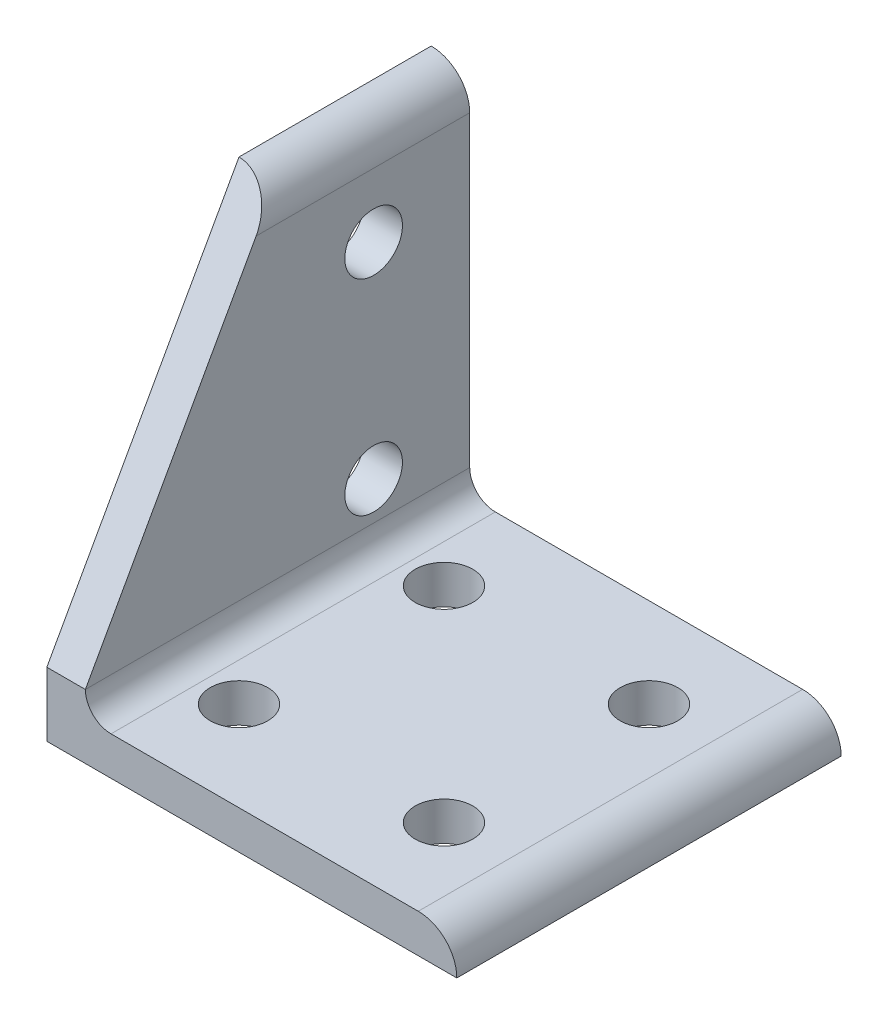
ISO-10303-21;
HEADER;
FILE_DESCRIPTION(('STEP AP214'),'2;1');
FILE_NAME('part.step','',(''),(''),'','','');
FILE_SCHEMA(('AUTOMOTIVE_DESIGN { 1 0 10303 214 1 1 1 1 }'));
ENDSEC;
DATA;
#1=APPLICATION_CONTEXT('core data for automotive mechanical design processes');
#2=APPLICATION_PROTOCOL_DEFINITION('international standard','automotive_design',2000,#1);
#3=PRODUCT_CONTEXT('',#1,'mechanical');
#4=PRODUCT('Part','Part','',(#3));
#5=PRODUCT_RELATED_PRODUCT_CATEGORY('part','',(#4));
#6=PRODUCT_DEFINITION_FORMATION('','',#4);
#7=PRODUCT_DEFINITION_CONTEXT('part definition',#1,'design');
#8=PRODUCT_DEFINITION('design','',#6,#7);
#9=PRODUCT_DEFINITION_SHAPE('','',#8);
#10=(LENGTH_UNIT() NAMED_UNIT(*) SI_UNIT(.MILLI.,.METRE.));
#11=(NAMED_UNIT(*) PLANE_ANGLE_UNIT() SI_UNIT($,.RADIAN.));
#12=(NAMED_UNIT(*) SI_UNIT($,.STERADIAN.) SOLID_ANGLE_UNIT());
#13=UNCERTAINTY_MEASURE_WITH_UNIT(LENGTH_MEASURE(1.E-05),#10,'distance_accuracy_value','');
#14=(GEOMETRIC_REPRESENTATION_CONTEXT(3) GLOBAL_UNCERTAINTY_ASSIGNED_CONTEXT((#13)) GLOBAL_UNIT_ASSIGNED_CONTEXT((#10,
#11,#12)) REPRESENTATION_CONTEXT('',''));
#15=CARTESIAN_POINT('',(0.,0.,0.));
#16=DIRECTION('',(0.,0.,1.));
#17=DIRECTION('',(1.,0.,0.));
#18=AXIS2_PLACEMENT_3D('',#15,#16,#17);
#19=CARTESIAN_POINT('',(-25.4,20.6248,-23.8125));
#20=DIRECTION('',(0.,0.,1.));
#21=DIRECTION('',(1.,0.,0.));
#22=AXIS2_PLACEMENT_3D('',#19,#20,#21);
#23=CYLINDRICAL_SURFACE('',#22,4.7752);
#24=CARTESIAN_POINT('',(-25.4,20.6248,2.65367516301126));
#25=DIRECTION('',(0.,-0.485752909125678,-0.874096168208019));
#26=DIRECTION('',(0.,-0.874096168208019,0.485752909125678));
#27=AXIS2_PLACEMENT_3D('',#24,#25,#26);
#28=ELLIPSE('',#27,5.46301445273421,4.7752);
#29=CARTESIAN_POINT('',(-20.6248,20.6248,2.65367516301126));
#30=VERTEX_POINT('',#29);
#31=CARTESIAN_POINT('',(-25.4,25.4,0.));
#32=VERTEX_POINT('',#31);
#33=EDGE_CURVE('E102',#30,#32,#28,.F.);
#34=ORIENTED_EDGE('',*,*,#33,.F.);
#35=DIRECTION('',(0.,0.,1.));
#36=VECTOR('',#35,1.);
#37=CARTESIAN_POINT('',(-20.6248,20.6248,-23.8125));
#38=LINE('',#37,#36);
#39=CARTESIAN_POINT('',(-20.6248,20.6248,-23.8125));
#40=VERTEX_POINT('',#39);
#41=EDGE_CURVE('E11',#40,#30,#38,.T.);
#42=ORIENTED_EDGE('',*,*,#41,.F.);
#43=CARTESIAN_POINT('',(-25.4,20.6248,-23.8125));
#44=DIRECTION('',(0.,0.,1.));
#45=DIRECTION('',(1.,0.,0.));
#46=AXIS2_PLACEMENT_3D('',#43,#44,#45);
#47=CIRCLE('',#46,4.7752);
#48=CARTESIAN_POINT('',(-25.4,25.4,-23.8125));
#49=VERTEX_POINT('',#48);
#50=EDGE_CURVE('E120',#40,#49,#47,.T.);
#51=ORIENTED_EDGE('',*,*,#50,.T.);
#52=DIRECTION('',(0.,0.,1.));
#53=VECTOR('',#52,1.);
#54=CARTESIAN_POINT('',(-25.4,25.4,-23.8125));
#55=LINE('',#54,#53);
#56=EDGE_CURVE('E44',#49,#32,#55,.T.);
#57=ORIENTED_EDGE('',*,*,#56,.T.);
#58=EDGE_LOOP('',(#34,#42,#51,#57));
#59=FACE_BOUND('',#58,.T.);
#60=ADVANCED_FACE('F41',(#59),#23,.T.);
#61=CARTESIAN_POINT('',(-20.6248,20.6248,-23.8125));
#62=DIRECTION('',(1.,0.,0.));
#63=DIRECTION('',(0.,1.,0.));
#64=AXIS2_PLACEMENT_3D('',#61,#62,#63);
#65=PLANE('',#64);
#66=CARTESIAN_POINT('',(-20.6248,12.7,-11.90625));
#67=DIRECTION('',(1.,0.,0.));
#68=DIRECTION('',(0.,1.,0.));
#69=AXIS2_PLACEMENT_3D('',#66,#67,#68);
#70=CIRCLE('',#69,3.5687);
#71=CARTESIAN_POINT('',(-20.6248,16.2687,-11.90625));
#72=VERTEX_POINT('',#71);
#73=EDGE_CURVE('E225',#72,#72,#70,.T.);
#74=ORIENTED_EDGE('',*,*,#73,.F.);
#75=EDGE_LOOP('',(#74));
#76=FACE_BOUND('',#75,.T.);
#77=CARTESIAN_POINT('',(-20.6248,-12.7,-11.90625));
#78=DIRECTION('',(1.,0.,0.));
#79=DIRECTION('',(0.,-1.,0.));
#80=AXIS2_PLACEMENT_3D('',#77,#78,#79);
#81=CIRCLE('',#80,3.5687);
#82=CARTESIAN_POINT('',(-20.6248,-16.2687,-11.90625));
#83=VERTEX_POINT('',#82);
#84=EDGE_CURVE('E216',#83,#83,#81,.T.);
#85=ORIENTED_EDGE('',*,*,#84,.F.);
#86=EDGE_LOOP('',(#85));
#87=FACE_BOUND('',#86,.T.);
#88=DIRECTION('',(0.,0.874096168208019,-0.485752909125678));
#89=VECTOR('',#88,1.);
#90=CARTESIAN_POINT('',(-20.6248,31.8621992004833,-3.59117471870367));
#91=LINE('',#90,#89);
#92=CARTESIAN_POINT('',(-20.6248,-17.4498,23.8125));
#93=VERTEX_POINT('',#92);
#94=EDGE_CURVE('E105',#93,#30,#91,.T.);
#95=ORIENTED_EDGE('',*,*,#94,.F.);
#96=DIRECTION('',(0.,0.,1.));
#97=VECTOR('',#96,1.);
#98=CARTESIAN_POINT('',(-20.6248,-17.4498,-23.8125));
#99=LINE('',#98,#97);
#100=CARTESIAN_POINT('',(-20.6248,-17.4498,-23.8125));
#101=VERTEX_POINT('',#100);
#102=EDGE_CURVE('E50',#101,#93,#99,.T.);
#103=ORIENTED_EDGE('',*,*,#102,.F.);
#104=DIRECTION('',(0.,1.,0.));
#105=VECTOR('',#104,1.);
#106=CARTESIAN_POINT('',(-20.6248,20.6248,-23.8125));
#107=LINE('',#106,#105);
#108=EDGE_CURVE('E123',#101,#40,#107,.T.);
#109=ORIENTED_EDGE('',*,*,#108,.T.);
#110=ORIENTED_EDGE('',*,*,#41,.T.);
#111=EDGE_LOOP('',(#95,#103,#109,#110));
#112=FACE_BOUND('',#111,.T.);
#113=ADVANCED_FACE('F295',(#76,#87,#112),#65,.T.);
#114=CARTESIAN_POINT('',(-17.4498,-17.4498,-23.8125));
#115=DIRECTION('',(0.,0.,1.));
#116=DIRECTION('',(1.,0.,0.));
#117=AXIS2_PLACEMENT_3D('',#114,#115,#116);
#118=CYLINDRICAL_SURFACE('',#117,3.175);
#119=ORIENTED_EDGE('',*,*,#102,.T.);
#120=CARTESIAN_POINT('',(-17.4498,-17.4498,23.8125));
#121=DIRECTION('',(0.,0.,-1.));
#122=DIRECTION('',(1.,0.,0.));
#123=AXIS2_PLACEMENT_3D('',#120,#121,#122);
#124=CIRCLE('',#123,3.175);
#125=CARTESIAN_POINT('',(-17.4498,-20.6248,23.8125));
#126=VERTEX_POINT('',#125);
#127=EDGE_CURVE('E177',#126,#93,#124,.T.);
#128=ORIENTED_EDGE('',*,*,#127,.F.);
#129=DIRECTION('',(0.,0.,1.));
#130=VECTOR('',#129,1.);
#131=CARTESIAN_POINT('',(-17.4498,-20.6248,-23.8125));
#132=LINE('',#131,#130);
#133=CARTESIAN_POINT('',(-17.4498,-20.6248,-23.8125));
#134=VERTEX_POINT('',#133);
#135=EDGE_CURVE('E143',#134,#126,#132,.T.);
#136=ORIENTED_EDGE('',*,*,#135,.F.);
#137=CARTESIAN_POINT('',(-17.4498,-17.4498,-23.8125));
#138=DIRECTION('',(0.,0.,-1.));
#139=DIRECTION('',(1.,0.,0.));
#140=AXIS2_PLACEMENT_3D('',#137,#138,#139);
#141=CIRCLE('',#140,3.175);
#142=EDGE_CURVE('E129',#134,#101,#141,.T.);
#143=ORIENTED_EDGE('',*,*,#142,.T.);
#144=EDGE_LOOP('',(#119,#128,#136,#143));
#145=FACE_BOUND('',#144,.T.);
#146=ADVANCED_FACE('F203',(#145),#118,.F.);
#147=CARTESIAN_POINT('',(-17.4498,-20.6248,-23.8125));
#148=DIRECTION('',(0.,1.,0.));
#149=DIRECTION('',(-1.,0.,0.));
#150=AXIS2_PLACEMENT_3D('',#147,#148,#149);
#151=PLANE('',#150);
#152=CARTESIAN_POINT('',(-12.7,-20.6248,12.7));
#153=DIRECTION('',(0.,1.,0.));
#154=DIRECTION('',(1.,0.,0.));
#155=AXIS2_PLACEMENT_3D('',#152,#153,#154);
#156=CIRCLE('',#155,3.5687);
#157=CARTESIAN_POINT('',(-9.1313,-20.6248,12.7));
#158=VERTEX_POINT('',#157);
#159=EDGE_CURVE('E240',#158,#158,#156,.T.);
#160=ORIENTED_EDGE('',*,*,#159,.F.);
#161=EDGE_LOOP('',(#160));
#162=FACE_BOUND('',#161,.T.);
#163=CARTESIAN_POINT('',(12.7,-20.6248,12.7));
#164=DIRECTION('',(0.,1.,0.));
#165=DIRECTION('',(1.,0.,0.));
#166=AXIS2_PLACEMENT_3D('',#163,#164,#165);
#167=CIRCLE('',#166,3.5687);
#168=CARTESIAN_POINT('',(16.2687,-20.6248,12.7));
#169=VERTEX_POINT('',#168);
#170=EDGE_CURVE('E248',#169,#169,#167,.T.);
#171=ORIENTED_EDGE('',*,*,#170,.F.);
#172=EDGE_LOOP('',(#171));
#173=FACE_BOUND('',#172,.T.);
#174=CARTESIAN_POINT('',(12.7,-20.6248,-12.7));
#175=DIRECTION('',(0.,1.,0.));
#176=DIRECTION('',(-1.,0.,0.));
#177=AXIS2_PLACEMENT_3D('',#174,#175,#176);
#178=CIRCLE('',#177,3.5687);
#179=CARTESIAN_POINT('',(9.1313,-20.6248,-12.7));
#180=VERTEX_POINT('',#179);
#181=EDGE_CURVE('E256',#180,#180,#178,.T.);
#182=ORIENTED_EDGE('',*,*,#181,.F.);
#183=EDGE_LOOP('',(#182));
#184=FACE_BOUND('',#183,.T.);
#185=CARTESIAN_POINT('',(-12.7,-20.6248,-12.7));
#186=DIRECTION('',(0.,1.,0.));
#187=DIRECTION('',(-1.,0.,0.));
#188=AXIS2_PLACEMENT_3D('',#185,#186,#187);
#189=CIRCLE('',#188,3.5687);
#190=CARTESIAN_POINT('',(-16.2687,-20.6248,-12.7));
#191=VERTEX_POINT('',#190);
#192=EDGE_CURVE('E232',#191,#191,#189,.T.);
#193=ORIENTED_EDGE('',*,*,#192,.F.);
#194=EDGE_LOOP('',(#193));
#195=FACE_BOUND('',#194,.T.);
#196=ORIENTED_EDGE('',*,*,#135,.T.);
#197=DIRECTION('',(-1.,0.,0.));
#198=VECTOR('',#197,1.);
#199=CARTESIAN_POINT('',(-17.4498,-20.6248,23.8125));
#200=LINE('',#199,#198);
#201=CARTESIAN_POINT('',(20.6248,-20.6248,23.8125));
#202=VERTEX_POINT('',#201);
#203=EDGE_CURVE('E173',#202,#126,#200,.T.);
#204=ORIENTED_EDGE('',*,*,#203,.F.);
#205=DIRECTION('',(0.,0.,1.));
#206=VECTOR('',#205,1.);
#207=CARTESIAN_POINT('',(20.6248,-20.6248,-23.8125));
#208=LINE('',#207,#206);
#209=CARTESIAN_POINT('',(20.6248,-20.6248,-23.8125));
#210=VERTEX_POINT('',#209);
#211=EDGE_CURVE('E146',#210,#202,#208,.T.);
#212=ORIENTED_EDGE('',*,*,#211,.F.);
#213=DIRECTION('',(-1.,0.,0.));
#214=VECTOR('',#213,1.);
#215=CARTESIAN_POINT('',(-17.4498,-20.6248,-23.8125));
#216=LINE('',#215,#214);
#217=EDGE_CURVE('E136',#210,#134,#216,.T.);
#218=ORIENTED_EDGE('',*,*,#217,.T.);
#219=EDGE_LOOP('',(#196,#204,#212,#218));
#220=FACE_BOUND('',#219,.T.);
#221=ADVANCED_FACE('F198',(#162,#173,#184,#195,#220),#151,.T.);
#222=CARTESIAN_POINT('',(20.6248,-25.4,-23.8125));
#223=DIRECTION('',(0.,0.,1.));
#224=DIRECTION('',(1.,0.,0.));
#225=AXIS2_PLACEMENT_3D('',#222,#223,#224);
#226=CYLINDRICAL_SURFACE('',#225,4.7752);
#227=ORIENTED_EDGE('',*,*,#211,.T.);
#228=CARTESIAN_POINT('',(20.6248,-25.4,23.8125));
#229=DIRECTION('',(0.,0.,1.));
#230=DIRECTION('',(-1.,0.,0.));
#231=AXIS2_PLACEMENT_3D('',#228,#229,#230);
#232=CIRCLE('',#231,4.7752);
#233=CARTESIAN_POINT('',(25.4,-25.4,23.8125));
#234=VERTEX_POINT('',#233);
#235=EDGE_CURVE('E167',#234,#202,#232,.T.);
#236=ORIENTED_EDGE('',*,*,#235,.F.);
#237=DIRECTION('',(0.,0.,1.));
#238=VECTOR('',#237,1.);
#239=CARTESIAN_POINT('',(25.4,-25.4,-23.8125));
#240=LINE('',#239,#238);
#241=CARTESIAN_POINT('',(25.4,-25.4,-23.8125));
#242=VERTEX_POINT('',#241);
#243=EDGE_CURVE('E127',#242,#234,#240,.T.);
#244=ORIENTED_EDGE('',*,*,#243,.F.);
#245=CARTESIAN_POINT('',(20.6248,-25.4,-23.8125));
#246=DIRECTION('',(0.,0.,1.));
#247=DIRECTION('',(-1.,0.,0.));
#248=AXIS2_PLACEMENT_3D('',#245,#246,#247);
#249=CIRCLE('',#248,4.7752);
#250=EDGE_CURVE('E191',#242,#210,#249,.T.);
#251=ORIENTED_EDGE('',*,*,#250,.T.);
#252=EDGE_LOOP('',(#227,#236,#244,#251));
#253=FACE_BOUND('',#252,.T.);
#254=ADVANCED_FACE('F171',(#253),#226,.T.);
#255=CARTESIAN_POINT('',(-25.4,-25.4,-23.8125));
#256=DIRECTION('',(0.,-1.,0.));
#257=DIRECTION('',(1.,0.,0.));
#258=AXIS2_PLACEMENT_3D('',#255,#256,#257);
#259=PLANE('',#258);
#260=CARTESIAN_POINT('',(-12.7,-25.4,12.7));
#261=DIRECTION('',(0.,1.,0.));
#262=DIRECTION('',(1.,0.,0.));
#263=AXIS2_PLACEMENT_3D('',#260,#261,#262);
#264=CIRCLE('',#263,3.5687);
#265=CARTESIAN_POINT('',(-9.1313,-25.4,12.7));
#266=VERTEX_POINT('',#265);
#267=EDGE_CURVE('E244',#266,#266,#264,.T.);
#268=ORIENTED_EDGE('',*,*,#267,.T.);
#269=EDGE_LOOP('',(#268));
#270=FACE_BOUND('',#269,.T.);
#271=CARTESIAN_POINT('',(12.7,-25.4,12.7));
#272=DIRECTION('',(0.,1.,0.));
#273=DIRECTION('',(1.,0.,0.));
#274=AXIS2_PLACEMENT_3D('',#271,#272,#273);
#275=CIRCLE('',#274,3.5687);
#276=CARTESIAN_POINT('',(16.2687,-25.4,12.7));
#277=VERTEX_POINT('',#276);
#278=EDGE_CURVE('E252',#277,#277,#275,.T.);
#279=ORIENTED_EDGE('',*,*,#278,.T.);
#280=EDGE_LOOP('',(#279));
#281=FACE_BOUND('',#280,.T.);
#282=CARTESIAN_POINT('',(12.7,-25.4,-12.7));
#283=DIRECTION('',(0.,1.,0.));
#284=DIRECTION('',(-1.,0.,0.));
#285=AXIS2_PLACEMENT_3D('',#282,#283,#284);
#286=CIRCLE('',#285,3.5687);
#287=CARTESIAN_POINT('',(9.1313,-25.4,-12.7));
#288=VERTEX_POINT('',#287);
#289=EDGE_CURVE('E236',#288,#288,#286,.T.);
#290=ORIENTED_EDGE('',*,*,#289,.T.);
#291=EDGE_LOOP('',(#290));
#292=FACE_BOUND('',#291,.T.);
#293=CARTESIAN_POINT('',(-12.7,-25.4,-12.7));
#294=DIRECTION('',(0.,1.,0.));
#295=DIRECTION('',(-1.,0.,0.));
#296=AXIS2_PLACEMENT_3D('',#293,#294,#295);
#297=CIRCLE('',#296,3.5687);
#298=CARTESIAN_POINT('',(-16.2687,-25.4,-12.7));
#299=VERTEX_POINT('',#298);
#300=EDGE_CURVE('E221',#299,#299,#297,.T.);
#301=ORIENTED_EDGE('',*,*,#300,.T.);
#302=EDGE_LOOP('',(#301));
#303=FACE_BOUND('',#302,.T.);
#304=ORIENTED_EDGE('',*,*,#243,.T.);
#305=DIRECTION('',(1.,0.,0.));
#306=VECTOR('',#305,1.);
#307=CARTESIAN_POINT('',(-25.4,-25.4,23.8125));
#308=LINE('',#307,#306);
#309=CARTESIAN_POINT('',(-25.4,-25.4,23.8125));
#310=VERTEX_POINT('',#309);
#311=EDGE_CURVE('E156',#310,#234,#308,.T.);
#312=ORIENTED_EDGE('',*,*,#311,.F.);
#313=DIRECTION('',(0.,0.,1.));
#314=VECTOR('',#313,1.);
#315=CARTESIAN_POINT('',(-25.4,-25.4,-23.8125));
#316=LINE('',#315,#314);
#317=CARTESIAN_POINT('',(-25.4,-25.4,-23.8125));
#318=VERTEX_POINT('',#317);
#319=EDGE_CURVE('E122',#318,#310,#316,.T.);
#320=ORIENTED_EDGE('',*,*,#319,.F.);
#321=DIRECTION('',(1.,0.,0.));
#322=VECTOR('',#321,1.);
#323=CARTESIAN_POINT('',(-25.4,-25.4,-23.8125));
#324=LINE('',#323,#322);
#325=EDGE_CURVE('E158',#318,#242,#324,.T.);
#326=ORIENTED_EDGE('',*,*,#325,.T.);
#327=EDGE_LOOP('',(#304,#312,#320,#326));
#328=FACE_BOUND('',#327,.T.);
#329=ADVANCED_FACE('F155',(#270,#281,#292,#303,#328),#259,.T.);
#330=CARTESIAN_POINT('',(-25.4,25.4,-23.8125));
#331=DIRECTION('',(-1.,0.,0.));
#332=DIRECTION('',(0.,-1.,0.));
#333=AXIS2_PLACEMENT_3D('',#330,#331,#332);
#334=PLANE('',#333);
#335=CARTESIAN_POINT('',(-25.4,12.7,-11.90625));
#336=DIRECTION('',(1.,0.,0.));
#337=DIRECTION('',(0.,1.,0.));
#338=AXIS2_PLACEMENT_3D('',#335,#336,#337);
#339=CIRCLE('',#338,3.5687);
#340=CARTESIAN_POINT('',(-25.4,16.2687,-11.90625));
#341=VERTEX_POINT('',#340);
#342=EDGE_CURVE('E118',#341,#341,#339,.T.);
#343=ORIENTED_EDGE('',*,*,#342,.T.);
#344=EDGE_LOOP('',(#343));
#345=FACE_BOUND('',#344,.T.);
#346=CARTESIAN_POINT('',(-25.4,-12.7,-11.90625));
#347=DIRECTION('',(1.,0.,0.));
#348=DIRECTION('',(0.,-1.,0.));
#349=AXIS2_PLACEMENT_3D('',#346,#347,#348);
#350=CIRCLE('',#349,3.5687);
#351=CARTESIAN_POINT('',(-25.4,-16.2687,-11.90625));
#352=VERTEX_POINT('',#351);
#353=EDGE_CURVE('E220',#352,#352,#350,.T.);
#354=ORIENTED_EDGE('',*,*,#353,.T.);
#355=EDGE_LOOP('',(#354));
#356=FACE_BOUND('',#355,.T.);
#357=DIRECTION('',(0.,0.874096168208019,-0.485752909125677));
#358=VECTOR('',#357,1.);
#359=CARTESIAN_POINT('',(-25.4,-17.4498,23.8125));
#360=LINE('',#359,#358);
#361=CARTESIAN_POINT('',(-25.4,-17.4498,23.8125));
#362=VERTEX_POINT('',#361);
#363=EDGE_CURVE('E58',#362,#32,#360,.T.);
#364=ORIENTED_EDGE('',*,*,#363,.T.);
#365=ORIENTED_EDGE('',*,*,#56,.F.);
#366=DIRECTION('',(0.,-1.,0.));
#367=VECTOR('',#366,1.);
#368=CARTESIAN_POINT('',(-25.4,25.4,-23.8125));
#369=LINE('',#368,#367);
#370=EDGE_CURVE('E186',#49,#318,#369,.T.);
#371=ORIENTED_EDGE('',*,*,#370,.T.);
#372=ORIENTED_EDGE('',*,*,#319,.T.);
#373=DIRECTION('',(0.,-1.,0.));
#374=VECTOR('',#373,1.);
#375=CARTESIAN_POINT('',(-25.4,25.4,23.8125));
#376=LINE('',#375,#374);
#377=EDGE_CURVE('E108',#362,#310,#376,.T.);
#378=ORIENTED_EDGE('',*,*,#377,.F.);
#379=EDGE_LOOP('',(#364,#365,#371,#372,#378));
#380=FACE_BOUND('',#379,.T.);
#381=ADVANCED_FACE('F112',(#345,#356,#380),#334,.T.);
#382=CARTESIAN_POINT('',(-25.4,20.6248,-23.8125));
#383=DIRECTION('',(0.,0.,1.));
#384=DIRECTION('',(1.,0.,0.));
#385=AXIS2_PLACEMENT_3D('',#382,#383,#384);
#386=PLANE('',#385);
#387=ORIENTED_EDGE('',*,*,#50,.F.);
#388=ORIENTED_EDGE('',*,*,#108,.F.);
#389=ORIENTED_EDGE('',*,*,#142,.F.);
#390=ORIENTED_EDGE('',*,*,#217,.F.);
#391=ORIENTED_EDGE('',*,*,#250,.F.);
#392=ORIENTED_EDGE('',*,*,#325,.F.);
#393=ORIENTED_EDGE('',*,*,#370,.F.);
#394=EDGE_LOOP('',(#387,#388,#389,#390,#391,#392,#393));
#395=FACE_BOUND('',#394,.T.);
#396=ADVANCED_FACE('F201',(#395),#386,.F.);
#397=CARTESIAN_POINT('',(-25.4,20.6248,23.8125));
#398=DIRECTION('',(0.,0.,1.));
#399=DIRECTION('',(1.,0.,0.));
#400=AXIS2_PLACEMENT_3D('',#397,#398,#399);
#401=PLANE('',#400);
#402=DIRECTION('',(1.,0.,0.));
#403=VECTOR('',#402,1.);
#404=CARTESIAN_POINT('',(-25.4,-17.4498,23.8125));
#405=LINE('',#404,#403);
#406=EDGE_CURVE('E117',#362,#93,#405,.T.);
#407=ORIENTED_EDGE('',*,*,#406,.F.);
#408=ORIENTED_EDGE('',*,*,#377,.T.);
#409=ORIENTED_EDGE('',*,*,#311,.T.);
#410=ORIENTED_EDGE('',*,*,#235,.T.);
#411=ORIENTED_EDGE('',*,*,#203,.T.);
#412=ORIENTED_EDGE('',*,*,#127,.T.);
#413=EDGE_LOOP('',(#407,#408,#409,#410,#411,#412));
#414=FACE_BOUND('',#413,.T.);
#415=ADVANCED_FACE('F165',(#414),#401,.T.);
#416=CARTESIAN_POINT('',(-25.4,-17.4498,23.8125));
#417=DIRECTION('',(0.,-0.485752909125678,-0.874096168208019));
#418=DIRECTION('',(0.,0.874096168208019,-0.485752909125678));
#419=AXIS2_PLACEMENT_3D('',#416,#417,#418);
#420=PLANE('',#419);
#421=ORIENTED_EDGE('',*,*,#33,.T.);
#422=ORIENTED_EDGE('',*,*,#363,.F.);
#423=ORIENTED_EDGE('',*,*,#406,.T.);
#424=ORIENTED_EDGE('',*,*,#94,.T.);
#425=EDGE_LOOP('',(#421,#422,#423,#424));
#426=FACE_BOUND('',#425,.T.);
#427=ADVANCED_FACE('F103',(#426),#420,.F.);
#428=CARTESIAN_POINT('',(-25.4,-12.7,-11.90625));
#429=DIRECTION('',(1.,0.,0.));
#430=DIRECTION('',(0.,1.,0.));
#431=AXIS2_PLACEMENT_3D('',#428,#429,#430);
#432=CYLINDRICAL_SURFACE('',#431,3.5687);
#433=ORIENTED_EDGE('',*,*,#353,.F.);
#434=EDGE_LOOP('',(#433));
#435=FACE_BOUND('',#434,.T.);
#436=ORIENTED_EDGE('',*,*,#84,.T.);
#437=EDGE_LOOP('',(#436));
#438=FACE_BOUND('',#437,.T.);
#439=ADVANCED_FACE('F289',(#435,#438),#432,.F.);
#440=CARTESIAN_POINT('',(-25.4,12.7,-11.90625));
#441=DIRECTION('',(1.,0.,0.));
#442=DIRECTION('',(0.,1.,0.));
#443=AXIS2_PLACEMENT_3D('',#440,#441,#442);
#444=CYLINDRICAL_SURFACE('',#443,3.5687);
#445=ORIENTED_EDGE('',*,*,#342,.F.);
#446=EDGE_LOOP('',(#445));
#447=FACE_BOUND('',#446,.T.);
#448=ORIENTED_EDGE('',*,*,#73,.T.);
#449=EDGE_LOOP('',(#448));
#450=FACE_BOUND('',#449,.T.);
#451=ADVANCED_FACE('F282',(#447,#450),#444,.F.);
#452=CARTESIAN_POINT('',(-12.7,-25.4,-12.7));
#453=DIRECTION('',(0.,1.,0.));
#454=DIRECTION('',(-1.,0.,0.));
#455=AXIS2_PLACEMENT_3D('',#452,#453,#454);
#456=CYLINDRICAL_SURFACE('',#455,3.5687);
#457=ORIENTED_EDGE('',*,*,#300,.F.);
#458=EDGE_LOOP('',(#457));
#459=FACE_BOUND('',#458,.T.);
#460=ORIENTED_EDGE('',*,*,#192,.T.);
#461=EDGE_LOOP('',(#460));
#462=FACE_BOUND('',#461,.T.);
#463=ADVANCED_FACE('F271',(#459,#462),#456,.F.);
#464=CARTESIAN_POINT('',(12.7,-25.4,-12.7));
#465=DIRECTION('',(0.,1.,0.));
#466=DIRECTION('',(-1.,0.,0.));
#467=AXIS2_PLACEMENT_3D('',#464,#465,#466);
#468=CYLINDRICAL_SURFACE('',#467,3.5687);
#469=ORIENTED_EDGE('',*,*,#289,.F.);
#470=EDGE_LOOP('',(#469));
#471=FACE_BOUND('',#470,.T.);
#472=ORIENTED_EDGE('',*,*,#181,.T.);
#473=EDGE_LOOP('',(#472));
#474=FACE_BOUND('',#473,.T.);
#475=ADVANCED_FACE('F267',(#471,#474),#468,.F.);
#476=CARTESIAN_POINT('',(12.7,-25.4,12.7));
#477=DIRECTION('',(0.,1.,0.));
#478=DIRECTION('',(-1.,0.,0.));
#479=AXIS2_PLACEMENT_3D('',#476,#477,#478);
#480=CYLINDRICAL_SURFACE('',#479,3.5687);
#481=ORIENTED_EDGE('',*,*,#278,.F.);
#482=EDGE_LOOP('',(#481));
#483=FACE_BOUND('',#482,.T.);
#484=ORIENTED_EDGE('',*,*,#170,.T.);
#485=EDGE_LOOP('',(#484));
#486=FACE_BOUND('',#485,.T.);
#487=ADVANCED_FACE('F270',(#483,#486),#480,.F.);
#488=CARTESIAN_POINT('',(-12.7,-25.4,12.7));
#489=DIRECTION('',(0.,1.,0.));
#490=DIRECTION('',(-1.,0.,0.));
#491=AXIS2_PLACEMENT_3D('',#488,#489,#490);
#492=CYLINDRICAL_SURFACE('',#491,3.5687);
#493=ORIENTED_EDGE('',*,*,#267,.F.);
#494=EDGE_LOOP('',(#493));
#495=FACE_BOUND('',#494,.T.);
#496=ORIENTED_EDGE('',*,*,#159,.T.);
#497=EDGE_LOOP('',(#496));
#498=FACE_BOUND('',#497,.T.);
#499=ADVANCED_FACE('F371',(#495,#498),#492,.F.);
#500=CLOSED_SHELL('',(#60,#113,#146,#221,#254,#329,#381,#396,#415,#427,#439,#451,#463,#475,#487,#499));
#501=MANIFOLD_SOLID_BREP('B2',#500);
#502=ADVANCED_BREP_SHAPE_REPRESENTATION('',(#18,#501),#14);
#503=SHAPE_DEFINITION_REPRESENTATION(#9,#502);
ENDSEC;
END-ISO-10303-21;
